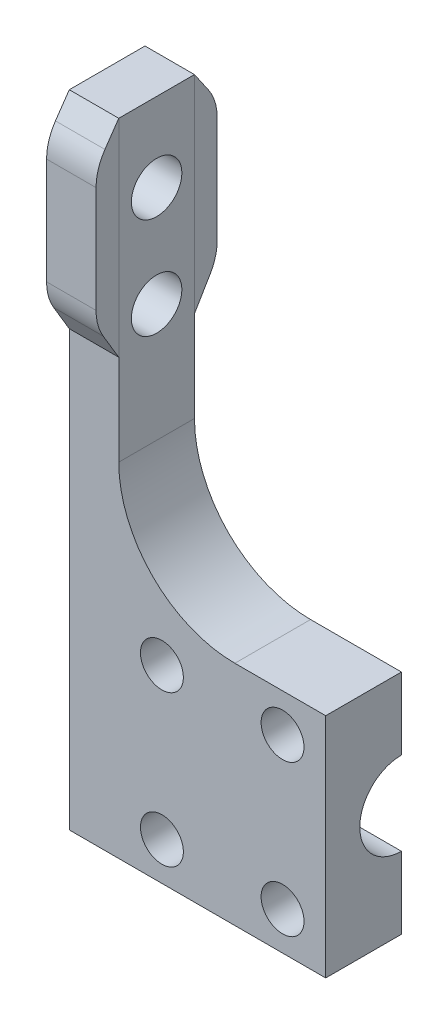
ISO-10303-21;
HEADER;
FILE_DESCRIPTION(('STEP AP214'),'2;1');
FILE_NAME('part.step','',(''),(''),'','','');
FILE_SCHEMA(('AUTOMOTIVE_DESIGN { 1 0 10303 214 1 1 1 1 }'));
ENDSEC;
DATA;
#1=APPLICATION_CONTEXT('core data for automotive mechanical design processes');
#2=APPLICATION_PROTOCOL_DEFINITION('international standard','automotive_design',2000,#1);
#3=PRODUCT_CONTEXT('',#1,'mechanical');
#4=PRODUCT('Part','Part','',(#3));
#5=PRODUCT_RELATED_PRODUCT_CATEGORY('part','',(#4));
#6=PRODUCT_DEFINITION_FORMATION('','',#4);
#7=PRODUCT_DEFINITION_CONTEXT('part definition',#1,'design');
#8=PRODUCT_DEFINITION('design','',#6,#7);
#9=PRODUCT_DEFINITION_SHAPE('','',#8);
#10=(LENGTH_UNIT() NAMED_UNIT(*) SI_UNIT(.MILLI.,.METRE.));
#11=(NAMED_UNIT(*) PLANE_ANGLE_UNIT() SI_UNIT($,.RADIAN.));
#12=(NAMED_UNIT(*) SI_UNIT($,.STERADIAN.) SOLID_ANGLE_UNIT());
#13=UNCERTAINTY_MEASURE_WITH_UNIT(LENGTH_MEASURE(1.E-05),#10,'distance_accuracy_value','');
#14=(GEOMETRIC_REPRESENTATION_CONTEXT(3) GLOBAL_UNCERTAINTY_ASSIGNED_CONTEXT((#13)) GLOBAL_UNIT_ASSIGNED_CONTEXT((#10,
#11,#12)) REPRESENTATION_CONTEXT('',''));
#15=CARTESIAN_POINT('',(0.,0.,0.));
#16=DIRECTION('',(0.,0.,1.));
#17=DIRECTION('',(1.,0.,0.));
#18=AXIS2_PLACEMENT_3D('',#15,#16,#17);
#19=CARTESIAN_POINT('',(-30.3,104.5,15.));
#20=DIRECTION('',(-1.,0.,0.));
#21=DIRECTION('',(0.,-1.,0.));
#22=AXIS2_PLACEMENT_3D('',#19,#20,#21);
#23=PLANE('',#22);
#24=DIRECTION('',(0.,1.,0.));
#25=VECTOR('',#24,1.);
#26=CARTESIAN_POINT('',(-30.3,63.5,15.));
#27=LINE('',#26,#25);
#28=CARTESIAN_POINT('',(-30.3,63.5,15.));
#29=VERTEX_POINT('',#28);
#30=CARTESIAN_POINT('',(-30.3,104.5,15.));
#31=VERTEX_POINT('',#30);
#32=EDGE_CURVE('E51',#29,#31,#27,.T.);
#33=ORIENTED_EDGE('',*,*,#32,.F.);
#34=DIRECTION('',(0.,-0.858384562837149,-0.513006766312957));
#35=VECTOR('',#34,1.);
#36=CARTESIAN_POINT('',(-30.3,63.5,15.));
#37=LINE('',#36,#35);
#38=CARTESIAN_POINT('',(-30.3,68.6600205989331,18.0838456283715));
#39=VERTEX_POINT('',#38);
#40=EDGE_CURVE('E125',#39,#29,#37,.T.);
#41=ORIENTED_EDGE('',*,*,#40,.F.);
#42=CARTESIAN_POINT('',(-30.3,73.7900882620627,9.50000000000002));
#43=DIRECTION('',(-1.,0.,0.));
#44=DIRECTION('',(0.,-1.,0.));
#45=AXIS2_PLACEMENT_3D('',#42,#43,#44);
#46=CIRCLE('',#45,10.);
#47=CARTESIAN_POINT('',(-30.3,73.7900882620627,19.5));
#48=VERTEX_POINT('',#47);
#49=EDGE_CURVE('E129',#48,#39,#46,.F.);
#50=ORIENTED_EDGE('',*,*,#49,.F.);
#51=DIRECTION('',(0.,-1.,0.));
#52=VECTOR('',#51,1.);
#53=CARTESIAN_POINT('',(-30.3,73.7900882620627,19.5));
#54=LINE('',#53,#52);
#55=CARTESIAN_POINT('',(-30.3,94.8518506562056,19.5));
#56=VERTEX_POINT('',#55);
#57=EDGE_CURVE('E80',#56,#48,#54,.T.);
#58=ORIENTED_EDGE('',*,*,#57,.F.);
#59=CARTESIAN_POINT('',(-30.3,94.8518506562057,9.50000000000002));
#60=DIRECTION('',(-1.,0.,0.));
#61=DIRECTION('',(0.,-1.,0.));
#62=AXIS2_PLACEMENT_3D('',#59,#60,#61);
#63=CIRCLE('',#62,10.);
#64=CARTESIAN_POINT('',(-30.3,100.520232847648,17.7382912871384));
#65=VERTEX_POINT('',#64);
#66=EDGE_CURVE('E85',#65,#56,#63,.F.);
#67=ORIENTED_EDGE('',*,*,#66,.F.);
#68=DIRECTION('',(0.,-0.823829128713842,0.566838219144221));
#69=VECTOR('',#68,1.);
#70=CARTESIAN_POINT('',(-30.3,100.520232847648,17.7382912871384));
#71=LINE('',#70,#69);
#72=EDGE_CURVE('E106',#31,#65,#71,.T.);
#73=ORIENTED_EDGE('',*,*,#72,.F.);
#74=EDGE_LOOP('',(#33,#41,#50,#58,#67,#73));
#75=FACE_BOUND('',#74,.T.);
#76=ADVANCED_FACE('F43',(#75),#23,.T.);
#77=CARTESIAN_POINT('',(-20.5,94.8518506562057,9.50000000000002));
#78=DIRECTION('',(-1.,0.,0.));
#79=DIRECTION('',(0.,0.,1.));
#80=AXIS2_PLACEMENT_3D('',#77,#78,#79);
#81=PLANE('',#80);
#82=DIRECTION('',(0.,1.,0.));
#83=VECTOR('',#82,1.);
#84=CARTESIAN_POINT('',(-20.5,63.5,15.));
#85=LINE('',#84,#83);
#86=CARTESIAN_POINT('',(-20.5,63.5,15.));
#87=VERTEX_POINT('',#86);
#88=CARTESIAN_POINT('',(-20.5,104.5,15.));
#89=VERTEX_POINT('',#88);
#90=EDGE_CURVE('E116',#87,#89,#85,.T.);
#91=ORIENTED_EDGE('',*,*,#90,.T.);
#92=DIRECTION('',(0.,-0.823829128713842,0.566838219144221));
#93=VECTOR('',#92,1.);
#94=CARTESIAN_POINT('',(-20.5,100.520232847648,17.7382912871384));
#95=LINE('',#94,#93);
#96=CARTESIAN_POINT('',(-20.5,100.520232847648,17.7382912871384));
#97=VERTEX_POINT('',#96);
#98=EDGE_CURVE('E104',#89,#97,#95,.T.);
#99=ORIENTED_EDGE('',*,*,#98,.T.);
#100=CARTESIAN_POINT('',(-20.5,94.8518506562057,9.50000000000002));
#101=DIRECTION('',(1.,0.,0.));
#102=DIRECTION('',(0.,0.,1.));
#103=AXIS2_PLACEMENT_3D('',#100,#101,#102);
#104=CIRCLE('',#103,10.);
#105=CARTESIAN_POINT('',(-20.5,94.8518506562056,19.5));
#106=VERTEX_POINT('',#105);
#107=EDGE_CURVE('E108',#97,#106,#104,.T.);
#108=ORIENTED_EDGE('',*,*,#107,.T.);
#109=DIRECTION('',(0.,-1.,0.));
#110=VECTOR('',#109,1.);
#111=CARTESIAN_POINT('',(-20.5,73.7900882620627,19.5));
#112=LINE('',#111,#110);
#113=CARTESIAN_POINT('',(-20.5,73.7900882620627,19.5));
#114=VERTEX_POINT('',#113);
#115=EDGE_CURVE('E112',#106,#114,#112,.T.);
#116=ORIENTED_EDGE('',*,*,#115,.T.);
#117=CARTESIAN_POINT('',(-20.5,73.7900882620627,9.50000000000002));
#118=DIRECTION('',(1.,0.,0.));
#119=DIRECTION('',(0.,0.,1.));
#120=AXIS2_PLACEMENT_3D('',#117,#118,#119);
#121=CIRCLE('',#120,10.);
#122=CARTESIAN_POINT('',(-20.5,68.6600205989331,18.0838456283715));
#123=VERTEX_POINT('',#122);
#124=EDGE_CURVE('E144',#114,#123,#121,.T.);
#125=ORIENTED_EDGE('',*,*,#124,.T.);
#126=DIRECTION('',(0.,-0.858384562837149,-0.513006766312957));
#127=VECTOR('',#126,1.);
#128=CARTESIAN_POINT('',(-20.5,63.5,15.));
#129=LINE('',#128,#127);
#130=EDGE_CURVE('E122',#123,#87,#129,.T.);
#131=ORIENTED_EDGE('',*,*,#130,.T.);
#132=EDGE_LOOP('',(#91,#99,#108,#116,#125,#131));
#133=FACE_BOUND('',#132,.T.);
#134=ADVANCED_FACE('F114',(#133),#81,.F.);
#135=CARTESIAN_POINT('',(-71.5462119472807,100.520232847648,17.7382912871384));
#136=DIRECTION('',(0.,0.566838219144221,0.823829128713842));
#137=DIRECTION('',(0.,-0.823829128713842,0.566838219144221));
#138=AXIS2_PLACEMENT_3D('',#135,#136,#137);
#139=PLANE('',#138);
#140=DIRECTION('',(1.,0.,0.));
#141=VECTOR('',#140,1.);
#142=CARTESIAN_POINT('',(-71.5462119472807,104.5,15.));
#143=LINE('',#142,#141);
#144=EDGE_CURVE('E12',#31,#89,#143,.T.);
#145=ORIENTED_EDGE('',*,*,#144,.F.);
#146=ORIENTED_EDGE('',*,*,#72,.T.);
#147=DIRECTION('',(1.,0.,0.));
#148=VECTOR('',#147,1.);
#149=CARTESIAN_POINT('',(-71.5462119472807,100.520232847648,17.7382912871384));
#150=LINE('',#149,#148);
#151=EDGE_CURVE('E101',#65,#97,#150,.T.);
#152=ORIENTED_EDGE('',*,*,#151,.T.);
#153=ORIENTED_EDGE('',*,*,#98,.F.);
#154=EDGE_LOOP('',(#145,#146,#152,#153));
#155=FACE_BOUND('',#154,.T.);
#156=ADVANCED_FACE('F102',(#155),#139,.T.);
#157=CARTESIAN_POINT('',(-71.5462119472807,94.8518506562057,9.50000000000002));
#158=DIRECTION('',(1.,0.,0.));
#159=DIRECTION('',(0.,1.,0.));
#160=AXIS2_PLACEMENT_3D('',#157,#158,#159);
#161=CYLINDRICAL_SURFACE('',#160,10.);
#162=ORIENTED_EDGE('',*,*,#151,.F.);
#163=ORIENTED_EDGE('',*,*,#66,.T.);
#164=DIRECTION('',(1.,0.,0.));
#165=VECTOR('',#164,1.);
#166=CARTESIAN_POINT('',(-71.5462119472807,94.8518506562056,19.5));
#167=LINE('',#166,#165);
#168=EDGE_CURVE('E96',#56,#106,#167,.T.);
#169=ORIENTED_EDGE('',*,*,#168,.T.);
#170=ORIENTED_EDGE('',*,*,#107,.F.);
#171=EDGE_LOOP('',(#162,#163,#169,#170));
#172=FACE_BOUND('',#171,.T.);
#173=ADVANCED_FACE('F109',(#172),#161,.T.);
#174=CARTESIAN_POINT('',(-71.5462119472807,73.7900882620627,19.5));
#175=DIRECTION('',(0.,0.,1.));
#176=DIRECTION('',(0.,-1.,0.));
#177=AXIS2_PLACEMENT_3D('',#174,#175,#176);
#178=PLANE('',#177);
#179=ORIENTED_EDGE('',*,*,#168,.F.);
#180=ORIENTED_EDGE('',*,*,#57,.T.);
#181=DIRECTION('',(1.,0.,0.));
#182=VECTOR('',#181,1.);
#183=CARTESIAN_POINT('',(-71.5462119472807,73.7900882620627,19.5));
#184=LINE('',#183,#182);
#185=EDGE_CURVE('E132',#48,#114,#184,.T.);
#186=ORIENTED_EDGE('',*,*,#185,.T.);
#187=ORIENTED_EDGE('',*,*,#115,.F.);
#188=EDGE_LOOP('',(#179,#180,#186,#187));
#189=FACE_BOUND('',#188,.T.);
#190=ADVANCED_FACE('F141',(#189),#178,.T.);
#191=CARTESIAN_POINT('',(-71.5462119472807,73.7900882620627,9.50000000000002));
#192=DIRECTION('',(1.,0.,0.));
#193=DIRECTION('',(0.,1.,0.));
#194=AXIS2_PLACEMENT_3D('',#191,#192,#193);
#195=CYLINDRICAL_SURFACE('',#194,10.);
#196=ORIENTED_EDGE('',*,*,#185,.F.);
#197=ORIENTED_EDGE('',*,*,#49,.T.);
#198=DIRECTION('',(1.,0.,0.));
#199=VECTOR('',#198,1.);
#200=CARTESIAN_POINT('',(-71.5462119472807,68.6600205989331,18.0838456283715));
#201=LINE('',#200,#199);
#202=EDGE_CURVE('E128',#39,#123,#201,.T.);
#203=ORIENTED_EDGE('',*,*,#202,.T.);
#204=ORIENTED_EDGE('',*,*,#124,.F.);
#205=EDGE_LOOP('',(#196,#197,#203,#204));
#206=FACE_BOUND('',#205,.T.);
#207=ADVANCED_FACE('F145',(#206),#195,.T.);
#208=CARTESIAN_POINT('',(-71.5462119472807,63.5,15.));
#209=DIRECTION('',(0.,-0.513006766312957,0.858384562837149));
#210=DIRECTION('',(0.,-0.858384562837149,-0.513006766312957));
#211=AXIS2_PLACEMENT_3D('',#208,#209,#210);
#212=PLANE('',#211);
#213=ORIENTED_EDGE('',*,*,#202,.F.);
#214=ORIENTED_EDGE('',*,*,#40,.T.);
#215=DIRECTION('',(1.,0.,0.));
#216=VECTOR('',#215,1.);
#217=CARTESIAN_POINT('',(-71.5462119472807,63.5,15.));
#218=LINE('',#217,#216);
#219=EDGE_CURVE('E124',#29,#87,#218,.T.);
#220=ORIENTED_EDGE('',*,*,#219,.T.);
#221=ORIENTED_EDGE('',*,*,#130,.F.);
#222=EDGE_LOOP('',(#213,#214,#220,#221));
#223=FACE_BOUND('',#222,.T.);
#224=ADVANCED_FACE('F151',(#223),#212,.T.);
#225=CARTESIAN_POINT('',(-71.5462119472807,63.5,15.));
#226=DIRECTION('',(0.,0.,-1.));
#227=DIRECTION('',(0.,1.,0.));
#228=AXIS2_PLACEMENT_3D('',#225,#226,#227);
#229=PLANE('',#228);
#230=ORIENTED_EDGE('',*,*,#219,.F.);
#231=ORIENTED_EDGE('',*,*,#32,.T.);
#232=ORIENTED_EDGE('',*,*,#144,.T.);
#233=ORIENTED_EDGE('',*,*,#90,.F.);
#234=EDGE_LOOP('',(#230,#231,#232,#233));
#235=FACE_BOUND('',#234,.T.);
#236=ADVANCED_FACE('F153',(#235),#229,.T.);
#237=CLOSED_SHELL('',(#76,#134,#156,#173,#190,#207,#224,#236));
#238=MANIFOLD_SOLID_BREP('B2',#237);
#239=CARTESIAN_POINT('',(-30.3,104.5,15.));
#240=DIRECTION('',(-1.,0.,0.));
#241=DIRECTION('',(0.,-1.,0.));
#242=AXIS2_PLACEMENT_3D('',#239,#240,#241);
#243=PLANE('',#242);
#244=DIRECTION('',(0.,-1.,0.));
#245=VECTOR('',#244,1.);
#246=CARTESIAN_POINT('',(-30.3,63.5,0.));
#247=LINE('',#246,#245);
#248=CARTESIAN_POINT('',(-30.3,104.5,0.));
#249=VERTEX_POINT('',#248);
#250=CARTESIAN_POINT('',(-30.3,63.5,0.));
#251=VERTEX_POINT('',#250);
#252=EDGE_CURVE('E235',#249,#251,#247,.T.);
#253=ORIENTED_EDGE('',*,*,#252,.F.);
#254=DIRECTION('',(0.,0.823829128713843,0.566838219144221));
#255=VECTOR('',#254,1.);
#256=CARTESIAN_POINT('',(-30.3,100.520232847648,-2.7382912871384));
#257=LINE('',#256,#255);
#258=CARTESIAN_POINT('',(-30.3,100.520232847648,-2.7382912871384));
#259=VERTEX_POINT('',#258);
#260=EDGE_CURVE('E309',#259,#249,#257,.T.);
#261=ORIENTED_EDGE('',*,*,#260,.F.);
#262=CARTESIAN_POINT('',(-30.3,94.8518506562057,5.5));
#263=DIRECTION('',(-1.,0.,0.));
#264=DIRECTION('',(0.,-1.,0.));
#265=AXIS2_PLACEMENT_3D('',#262,#263,#264);
#266=CIRCLE('',#265,10.);
#267=CARTESIAN_POINT('',(-30.3,94.8518506562056,-4.5));
#268=VERTEX_POINT('',#267);
#269=EDGE_CURVE('E313',#268,#259,#266,.F.);
#270=ORIENTED_EDGE('',*,*,#269,.F.);
#271=DIRECTION('',(0.,1.,0.));
#272=VECTOR('',#271,1.);
#273=CARTESIAN_POINT('',(-30.3,73.7900882620627,-4.5));
#274=LINE('',#273,#272);
#275=CARTESIAN_POINT('',(-30.3,73.7900882620627,-4.5));
#276=VERTEX_POINT('',#275);
#277=EDGE_CURVE('E264',#276,#268,#274,.T.);
#278=ORIENTED_EDGE('',*,*,#277,.F.);
#279=CARTESIAN_POINT('',(-30.3,73.7900882620627,5.5));
#280=DIRECTION('',(-1.,0.,0.));
#281=DIRECTION('',(0.,-1.,0.));
#282=AXIS2_PLACEMENT_3D('',#279,#280,#281);
#283=CIRCLE('',#282,10.);
#284=CARTESIAN_POINT('',(-30.3,68.6600205989331,-3.08384562837148));
#285=VERTEX_POINT('',#284);
#286=EDGE_CURVE('E269',#285,#276,#283,.F.);
#287=ORIENTED_EDGE('',*,*,#286,.F.);
#288=DIRECTION('',(0.,0.858384562837149,-0.513006766312956));
#289=VECTOR('',#288,1.);
#290=CARTESIAN_POINT('',(-30.3,63.5,0.));
#291=LINE('',#290,#289);
#292=EDGE_CURVE('E290',#251,#285,#291,.T.);
#293=ORIENTED_EDGE('',*,*,#292,.F.);
#294=EDGE_LOOP('',(#253,#261,#270,#278,#287,#293));
#295=FACE_BOUND('',#294,.T.);
#296=ADVANCED_FACE('F227',(#295),#243,.T.);
#297=CARTESIAN_POINT('',(-20.5,94.8518506562057,5.5));
#298=DIRECTION('',(1.,0.,0.));
#299=DIRECTION('',(0.,0.,-1.));
#300=AXIS2_PLACEMENT_3D('',#297,#298,#299);
#301=PLANE('',#300);
#302=DIRECTION('',(0.,-1.,0.));
#303=VECTOR('',#302,1.);
#304=CARTESIAN_POINT('',(-20.5,63.5,0.));
#305=LINE('',#304,#303);
#306=CARTESIAN_POINT('',(-20.5,104.5,0.));
#307=VERTEX_POINT('',#306);
#308=CARTESIAN_POINT('',(-20.5,63.5,0.));
#309=VERTEX_POINT('',#308);
#310=EDGE_CURVE('E300',#307,#309,#305,.T.);
#311=ORIENTED_EDGE('',*,*,#310,.T.);
#312=DIRECTION('',(0.,0.858384562837149,-0.513006766312956));
#313=VECTOR('',#312,1.);
#314=CARTESIAN_POINT('',(-20.5,63.5,0.));
#315=LINE('',#314,#313);
#316=CARTESIAN_POINT('',(-20.5,68.6600205989331,-3.08384562837148));
#317=VERTEX_POINT('',#316);
#318=EDGE_CURVE('E288',#309,#317,#315,.T.);
#319=ORIENTED_EDGE('',*,*,#318,.T.);
#320=CARTESIAN_POINT('',(-20.5,73.7900882620627,5.5));
#321=DIRECTION('',(1.,0.,0.));
#322=DIRECTION('',(0.,0.,-1.));
#323=AXIS2_PLACEMENT_3D('',#320,#321,#322);
#324=CIRCLE('',#323,10.);
#325=CARTESIAN_POINT('',(-20.5,73.7900882620627,-4.5));
#326=VERTEX_POINT('',#325);
#327=EDGE_CURVE('E292',#317,#326,#324,.T.);
#328=ORIENTED_EDGE('',*,*,#327,.T.);
#329=DIRECTION('',(0.,1.,0.));
#330=VECTOR('',#329,1.);
#331=CARTESIAN_POINT('',(-20.5,73.7900882620627,-4.5));
#332=LINE('',#331,#330);
#333=CARTESIAN_POINT('',(-20.5,94.8518506562056,-4.5));
#334=VERTEX_POINT('',#333);
#335=EDGE_CURVE('E296',#326,#334,#332,.T.);
#336=ORIENTED_EDGE('',*,*,#335,.T.);
#337=CARTESIAN_POINT('',(-20.5,94.8518506562057,5.5));
#338=DIRECTION('',(1.,0.,0.));
#339=DIRECTION('',(0.,0.,-1.));
#340=AXIS2_PLACEMENT_3D('',#337,#338,#339);
#341=CIRCLE('',#340,10.);
#342=CARTESIAN_POINT('',(-20.5,100.520232847648,-2.7382912871384));
#343=VERTEX_POINT('',#342);
#344=EDGE_CURVE('E328',#334,#343,#341,.T.);
#345=ORIENTED_EDGE('',*,*,#344,.T.);
#346=DIRECTION('',(0.,0.823829128713842,0.566838219144221));
#347=VECTOR('',#346,1.);
#348=CARTESIAN_POINT('',(-20.5,100.520232847648,-2.7382912871384));
#349=LINE('',#348,#347);
#350=EDGE_CURVE('E306',#343,#307,#349,.T.);
#351=ORIENTED_EDGE('',*,*,#350,.T.);
#352=EDGE_LOOP('',(#311,#319,#328,#336,#345,#351));
#353=FACE_BOUND('',#352,.T.);
#354=ADVANCED_FACE('F298',(#353),#301,.T.);
#355=CARTESIAN_POINT('',(-71.5462119472807,63.5,0.));
#356=DIRECTION('',(0.,-0.513006766312956,-0.858384562837149));
#357=DIRECTION('',(0.,0.858384562837149,-0.513006766312956));
#358=AXIS2_PLACEMENT_3D('',#355,#356,#357);
#359=PLANE('',#358);
#360=DIRECTION('',(1.,0.,0.));
#361=VECTOR('',#360,1.);
#362=CARTESIAN_POINT('',(-71.5462119472807,63.5,0.));
#363=LINE('',#362,#361);
#364=EDGE_CURVE('E41',#251,#309,#363,.T.);
#365=ORIENTED_EDGE('',*,*,#364,.F.);
#366=ORIENTED_EDGE('',*,*,#292,.T.);
#367=DIRECTION('',(1.,0.,0.));
#368=VECTOR('',#367,1.);
#369=CARTESIAN_POINT('',(-71.5462119472807,68.6600205989331,-3.08384562837148));
#370=LINE('',#369,#368);
#371=EDGE_CURVE('E285',#285,#317,#370,.T.);
#372=ORIENTED_EDGE('',*,*,#371,.T.);
#373=ORIENTED_EDGE('',*,*,#318,.F.);
#374=EDGE_LOOP('',(#365,#366,#372,#373));
#375=FACE_BOUND('',#374,.T.);
#376=ADVANCED_FACE('F286',(#375),#359,.T.);
#377=CARTESIAN_POINT('',(-71.5462119472807,73.7900882620627,5.5));
#378=DIRECTION('',(1.,0.,0.));
#379=DIRECTION('',(0.,1.,0.));
#380=AXIS2_PLACEMENT_3D('',#377,#378,#379);
#381=CYLINDRICAL_SURFACE('',#380,10.);
#382=ORIENTED_EDGE('',*,*,#371,.F.);
#383=ORIENTED_EDGE('',*,*,#286,.T.);
#384=DIRECTION('',(1.,0.,0.));
#385=VECTOR('',#384,1.);
#386=CARTESIAN_POINT('',(-71.5462119472807,73.7900882620627,-4.5));
#387=LINE('',#386,#385);
#388=EDGE_CURVE('E280',#276,#326,#387,.T.);
#389=ORIENTED_EDGE('',*,*,#388,.T.);
#390=ORIENTED_EDGE('',*,*,#327,.F.);
#391=EDGE_LOOP('',(#382,#383,#389,#390));
#392=FACE_BOUND('',#391,.T.);
#393=ADVANCED_FACE('F293',(#392),#381,.T.);
#394=CARTESIAN_POINT('',(-71.5462119472807,73.7900882620627,-4.5));
#395=DIRECTION('',(0.,0.,-1.));
#396=DIRECTION('',(-1.,0.,0.));
#397=AXIS2_PLACEMENT_3D('',#394,#395,#396);
#398=PLANE('',#397);
#399=ORIENTED_EDGE('',*,*,#388,.F.);
#400=ORIENTED_EDGE('',*,*,#277,.T.);
#401=DIRECTION('',(1.,0.,0.));
#402=VECTOR('',#401,1.);
#403=CARTESIAN_POINT('',(-71.5462119472807,94.8518506562056,-4.5));
#404=LINE('',#403,#402);
#405=EDGE_CURVE('E316',#268,#334,#404,.T.);
#406=ORIENTED_EDGE('',*,*,#405,.T.);
#407=ORIENTED_EDGE('',*,*,#335,.F.);
#408=EDGE_LOOP('',(#399,#400,#406,#407));
#409=FACE_BOUND('',#408,.T.);
#410=ADVANCED_FACE('F325',(#409),#398,.T.);
#411=CARTESIAN_POINT('',(-71.5462119472807,94.8518506562057,5.5));
#412=DIRECTION('',(1.,0.,0.));
#413=DIRECTION('',(0.,1.,0.));
#414=AXIS2_PLACEMENT_3D('',#411,#412,#413);
#415=CYLINDRICAL_SURFACE('',#414,10.);
#416=ORIENTED_EDGE('',*,*,#405,.F.);
#417=ORIENTED_EDGE('',*,*,#269,.T.);
#418=DIRECTION('',(1.,0.,0.));
#419=VECTOR('',#418,1.);
#420=CARTESIAN_POINT('',(-71.5462119472807,100.520232847648,-2.7382912871384));
#421=LINE('',#420,#419);
#422=EDGE_CURVE('E312',#259,#343,#421,.T.);
#423=ORIENTED_EDGE('',*,*,#422,.T.);
#424=ORIENTED_EDGE('',*,*,#344,.F.);
#425=EDGE_LOOP('',(#416,#417,#423,#424));
#426=FACE_BOUND('',#425,.T.);
#427=ADVANCED_FACE('F329',(#426),#415,.T.);
#428=CARTESIAN_POINT('',(-71.5462119472807,100.520232847648,-2.7382912871384));
#429=DIRECTION('',(0.,0.566838219144221,-0.823829128713842));
#430=DIRECTION('',(0.,0.823829128713843,0.566838219144221));
#431=AXIS2_PLACEMENT_3D('',#428,#429,#430);
#432=PLANE('',#431);
#433=ORIENTED_EDGE('',*,*,#422,.F.);
#434=ORIENTED_EDGE('',*,*,#260,.T.);
#435=DIRECTION('',(1.,0.,0.));
#436=VECTOR('',#435,1.);
#437=CARTESIAN_POINT('',(-71.5462119472807,104.5,0.));
#438=LINE('',#437,#436);
#439=EDGE_CURVE('E308',#249,#307,#438,.T.);
#440=ORIENTED_EDGE('',*,*,#439,.T.);
#441=ORIENTED_EDGE('',*,*,#350,.F.);
#442=EDGE_LOOP('',(#433,#434,#440,#441));
#443=FACE_BOUND('',#442,.T.);
#444=ADVANCED_FACE('F335',(#443),#432,.T.);
#445=CARTESIAN_POINT('',(-71.5462119472807,63.5,0.));
#446=DIRECTION('',(0.,0.,1.));
#447=DIRECTION('',(1.,0.,0.));
#448=AXIS2_PLACEMENT_3D('',#445,#446,#447);
#449=PLANE('',#448);
#450=ORIENTED_EDGE('',*,*,#439,.F.);
#451=ORIENTED_EDGE('',*,*,#252,.T.);
#452=ORIENTED_EDGE('',*,*,#364,.T.);
#453=ORIENTED_EDGE('',*,*,#310,.F.);
#454=EDGE_LOOP('',(#450,#451,#452,#453));
#455=FACE_BOUND('',#454,.T.);
#456=ADVANCED_FACE('F337',(#455),#449,.T.);
#457=CLOSED_SHELL('',(#296,#354,#376,#393,#410,#427,#444,#456));
#458=MANIFOLD_SOLID_BREP('B6',#457);
#459=CARTESIAN_POINT('',(0.,0.,0.));
#460=DIRECTION('',(0.,0.,1.));
#461=DIRECTION('',(1.,0.,0.));
#462=AXIS2_PLACEMENT_3D('',#459,#460,#461);
#463=PLANE('',#462);
#464=CARTESIAN_POINT('',(-11.95,-14.95,0.));
#465=DIRECTION('',(0.,0.,1.));
#466=DIRECTION('',(1.,0.,0.));
#467=AXIS2_PLACEMENT_3D('',#464,#465,#466);
#468=CIRCLE('',#467,4.25);
#469=CARTESIAN_POINT('',(-7.7,-14.95,0.));
#470=VERTEX_POINT('',#469);
#471=EDGE_CURVE('E501',#470,#470,#468,.T.);
#472=ORIENTED_EDGE('',*,*,#471,.T.);
#473=EDGE_LOOP('',(#472));
#474=FACE_BOUND('',#473,.T.);
#475=CARTESIAN_POINT('',(11.95,-14.95,0.));
#476=DIRECTION('',(0.,0.,1.));
#477=DIRECTION('',(1.,0.,0.));
#478=AXIS2_PLACEMENT_3D('',#475,#476,#477);
#479=CIRCLE('',#478,4.25);
#480=CARTESIAN_POINT('',(16.2,-14.95,0.));
#481=VERTEX_POINT('',#480);
#482=EDGE_CURVE('E508',#481,#481,#479,.T.);
#483=ORIENTED_EDGE('',*,*,#482,.T.);
#484=EDGE_LOOP('',(#483));
#485=FACE_BOUND('',#484,.T.);
#486=DIRECTION('',(0.,1.,0.));
#487=VECTOR('',#486,1.);
#488=CARTESIAN_POINT('',(-30.3,104.5,0.));
#489=LINE('',#488,#487);
#490=CARTESIAN_POINT('',(-30.3,-22.5,0.));
#491=VERTEX_POINT('',#490);
#492=CARTESIAN_POINT('',(-30.3,-8.25,0.));
#493=VERTEX_POINT('',#492);
#494=EDGE_CURVE('E480',#491,#493,#489,.T.);
#495=ORIENTED_EDGE('',*,*,#494,.T.);
#496=DIRECTION('',(1.,0.,0.));
#497=VECTOR('',#496,1.);
#498=CARTESIAN_POINT('',(-44.5,-8.25,0.));
#499=LINE('',#498,#497);
#500=CARTESIAN_POINT('',(20.5,-8.25,0.));
#501=VERTEX_POINT('',#500);
#502=EDGE_CURVE('E416',#493,#501,#499,.T.);
#503=ORIENTED_EDGE('',*,*,#502,.T.);
#504=DIRECTION('',(0.,1.,0.));
#505=VECTOR('',#504,1.);
#506=CARTESIAN_POINT('',(20.5,22.5,0.));
#507=LINE('',#506,#505);
#508=CARTESIAN_POINT('',(20.5,-22.5,0.));
#509=VERTEX_POINT('',#508);
#510=EDGE_CURVE('E458',#509,#501,#507,.T.);
#511=ORIENTED_EDGE('',*,*,#510,.F.);
#512=DIRECTION('',(1.,0.,0.));
#513=VECTOR('',#512,1.);
#514=CARTESIAN_POINT('',(-20.5,-22.5,0.));
#515=LINE('',#514,#513);
#516=EDGE_CURVE('E439',#491,#509,#515,.T.);
#517=ORIENTED_EDGE('',*,*,#516,.F.);
#518=EDGE_LOOP('',(#495,#503,#511,#517));
#519=FACE_BOUND('',#518,.T.);
#520=ADVANCED_FACE('F402',(#474,#485,#519),#463,.F.);
#521=CARTESIAN_POINT('',(0.,0.,15.));
#522=DIRECTION('',(0.,0.,1.));
#523=DIRECTION('',(1.,0.,0.));
#524=AXIS2_PLACEMENT_3D('',#521,#522,#523);
#525=PLANE('',#524);
#526=CARTESIAN_POINT('',(11.95,-14.95,15.));
#527=DIRECTION('',(0.,0.,1.));
#528=DIRECTION('',(1.,0.,0.));
#529=AXIS2_PLACEMENT_3D('',#526,#527,#528);
#530=CIRCLE('',#529,4.25);
#531=CARTESIAN_POINT('',(16.2,-14.95,15.));
#532=VERTEX_POINT('',#531);
#533=EDGE_CURVE('E511',#532,#532,#530,.T.);
#534=ORIENTED_EDGE('',*,*,#533,.F.);
#535=EDGE_LOOP('',(#534));
#536=FACE_BOUND('',#535,.T.);
#537=CARTESIAN_POINT('',(-11.95,14.95,15.));
#538=DIRECTION('',(0.,0.,1.));
#539=DIRECTION('',(1.,0.,0.));
#540=AXIS2_PLACEMENT_3D('',#537,#538,#539);
#541=CIRCLE('',#540,4.25);
#542=CARTESIAN_POINT('',(-7.7,14.95,15.));
#543=VERTEX_POINT('',#542);
#544=EDGE_CURVE('E465',#543,#543,#541,.T.);
#545=ORIENTED_EDGE('',*,*,#544,.F.);
#546=EDGE_LOOP('',(#545));
#547=FACE_BOUND('',#546,.T.);
#548=DIRECTION('',(0.,1.,0.));
#549=VECTOR('',#548,1.);
#550=CARTESIAN_POINT('',(20.5,22.5,15.));
#551=LINE('',#550,#549);
#552=CARTESIAN_POINT('',(20.5,-22.5,15.));
#553=VERTEX_POINT('',#552);
#554=CARTESIAN_POINT('',(20.5,22.5,15.));
#555=VERTEX_POINT('',#554);
#556=EDGE_CURVE('E451',#553,#555,#551,.T.);
#557=ORIENTED_EDGE('',*,*,#556,.T.);
#558=DIRECTION('',(-1.,0.,0.));
#559=VECTOR('',#558,1.);
#560=CARTESIAN_POINT('',(-20.5,22.5,15.));
#561=LINE('',#560,#559);
#562=CARTESIAN_POINT('',(2.50000000000017,22.5,15.));
#563=VERTEX_POINT('',#562);
#564=EDGE_CURVE('E527',#555,#563,#561,.T.);
#565=ORIENTED_EDGE('',*,*,#564,.T.);
#566=CARTESIAN_POINT('',(2.50000000000001,45.5,15.));
#567=DIRECTION('',(0.,0.,1.));
#568=DIRECTION('',(-1.,0.,0.));
#569=AXIS2_PLACEMENT_3D('',#566,#567,#568);
#570=CIRCLE('',#569,23.);
#571=CARTESIAN_POINT('',(-20.5,45.5000000000002,15.));
#572=VERTEX_POINT('',#571);
#573=EDGE_CURVE('E536',#572,#563,#570,.T.);
#574=ORIENTED_EDGE('',*,*,#573,.F.);
#575=DIRECTION('',(0.,-1.,0.));
#576=VECTOR('',#575,1.);
#577=CARTESIAN_POINT('',(-20.5,-22.5,15.));
#578=LINE('',#577,#576);
#579=CARTESIAN_POINT('',(-20.5,104.5,15.));
#580=VERTEX_POINT('',#579);
#581=EDGE_CURVE('E491',#580,#572,#578,.T.);
#582=ORIENTED_EDGE('',*,*,#581,.F.);
#583=DIRECTION('',(1.,0.,0.));
#584=VECTOR('',#583,1.);
#585=CARTESIAN_POINT('',(-20.5,104.5,15.));
#586=LINE('',#585,#584);
#587=CARTESIAN_POINT('',(-30.3,104.5,15.));
#588=VERTEX_POINT('',#587);
#589=EDGE_CURVE('E569',#588,#580,#586,.T.);
#590=ORIENTED_EDGE('',*,*,#589,.F.);
#591=DIRECTION('',(0.,1.,0.));
#592=VECTOR('',#591,1.);
#593=CARTESIAN_POINT('',(-30.3,104.5,15.));
#594=LINE('',#593,#592);
#595=CARTESIAN_POINT('',(-30.3,-22.5,15.));
#596=VERTEX_POINT('',#595);
#597=EDGE_CURVE('E497',#596,#588,#594,.T.);
#598=ORIENTED_EDGE('',*,*,#597,.F.);
#599=DIRECTION('',(1.,0.,0.));
#600=VECTOR('',#599,1.);
#601=CARTESIAN_POINT('',(-20.5,-22.5,15.));
#602=LINE('',#601,#600);
#603=EDGE_CURVE('E425',#596,#553,#602,.T.);
#604=ORIENTED_EDGE('',*,*,#603,.T.);
#605=EDGE_LOOP('',(#557,#565,#574,#582,#590,#598,#604));
#606=FACE_BOUND('',#605,.T.);
#607=CARTESIAN_POINT('',(11.95,14.95,15.));
#608=DIRECTION('',(0.,0.,1.));
#609=DIRECTION('',(1.,0.,0.));
#610=AXIS2_PLACEMENT_3D('',#607,#608,#609);
#611=CIRCLE('',#610,4.25);
#612=CARTESIAN_POINT('',(16.2,14.95,15.));
#613=VERTEX_POINT('',#612);
#614=EDGE_CURVE('E517',#613,#613,#611,.T.);
#615=ORIENTED_EDGE('',*,*,#614,.F.);
#616=EDGE_LOOP('',(#615));
#617=FACE_BOUND('',#616,.T.);
#618=CARTESIAN_POINT('',(-11.95,-14.95,15.));
#619=DIRECTION('',(0.,0.,1.));
#620=DIRECTION('',(1.,0.,0.));
#621=AXIS2_PLACEMENT_3D('',#618,#619,#620);
#622=CIRCLE('',#621,4.25);
#623=CARTESIAN_POINT('',(-7.7,-14.95,15.));
#624=VERTEX_POINT('',#623);
#625=EDGE_CURVE('E505',#624,#624,#622,.T.);
#626=ORIENTED_EDGE('',*,*,#625,.F.);
#627=EDGE_LOOP('',(#626));
#628=FACE_BOUND('',#627,.T.);
#629=ADVANCED_FACE('F531',(#536,#547,#606,#617,#628),#525,.T.);
#630=CARTESIAN_POINT('',(20.5,8.25,0.));
#631=VERTEX_POINT('',#630);
#632=CARTESIAN_POINT('',(20.5,22.5,0.));
#633=VERTEX_POINT('',#632);
#634=EDGE_CURVE('E461',#631,#633,#507,.T.);
#635=ORIENTED_EDGE('',*,*,#634,.F.);
#636=DIRECTION('',(1.,0.,0.));
#637=VECTOR('',#636,1.);
#638=CARTESIAN_POINT('',(-44.5,8.25,0.));
#639=LINE('',#638,#637);
#640=CARTESIAN_POINT('',(-30.3,8.25,0.));
#641=VERTEX_POINT('',#640);
#642=EDGE_CURVE('E560',#631,#641,#639,.F.);
#643=ORIENTED_EDGE('',*,*,#642,.T.);
#644=CARTESIAN_POINT('',(-30.3,104.5,0.));
#645=VERTEX_POINT('',#644);
#646=EDGE_CURVE('E476',#641,#645,#489,.T.);
#647=ORIENTED_EDGE('',*,*,#646,.T.);
#648=DIRECTION('',(1.,0.,0.));
#649=VECTOR('',#648,1.);
#650=CARTESIAN_POINT('',(-20.5,104.5,0.));
#651=LINE('',#650,#649);
#652=CARTESIAN_POINT('',(-20.5,104.5,0.));
#653=VERTEX_POINT('',#652);
#654=EDGE_CURVE('E488',#645,#653,#651,.T.);
#655=ORIENTED_EDGE('',*,*,#654,.T.);
#656=DIRECTION('',(0.,-1.,0.));
#657=VECTOR('',#656,1.);
#658=CARTESIAN_POINT('',(-20.5,-22.5,0.));
#659=LINE('',#658,#657);
#660=CARTESIAN_POINT('',(-20.5,45.5000000000002,0.));
#661=VERTEX_POINT('',#660);
#662=EDGE_CURVE('E494',#653,#661,#659,.T.);
#663=ORIENTED_EDGE('',*,*,#662,.T.);
#664=CARTESIAN_POINT('',(2.50000000000001,45.5,0.));
#665=DIRECTION('',(0.,0.,1.));
#666=DIRECTION('',(-1.,0.,0.));
#667=AXIS2_PLACEMENT_3D('',#664,#665,#666);
#668=CIRCLE('',#667,23.);
#669=CARTESIAN_POINT('',(2.50000000000017,22.5,0.));
#670=VERTEX_POINT('',#669);
#671=EDGE_CURVE('E555',#661,#670,#668,.T.);
#672=ORIENTED_EDGE('',*,*,#671,.T.);
#673=DIRECTION('',(-1.,0.,0.));
#674=VECTOR('',#673,1.);
#675=CARTESIAN_POINT('',(-20.5,22.5,0.));
#676=LINE('',#675,#674);
#677=EDGE_CURVE('E452',#633,#670,#676,.T.);
#678=ORIENTED_EDGE('',*,*,#677,.F.);
#679=EDGE_LOOP('',(#635,#643,#647,#655,#663,#672,#678));
#680=FACE_BOUND('',#679,.T.);
#681=CARTESIAN_POINT('',(-11.95,14.95,0.));
#682=DIRECTION('',(0.,0.,1.));
#683=DIRECTION('',(1.,0.,0.));
#684=AXIS2_PLACEMENT_3D('',#681,#682,#683);
#685=CIRCLE('',#684,4.25);
#686=CARTESIAN_POINT('',(-7.7,14.95,0.));
#687=VERTEX_POINT('',#686);
#688=EDGE_CURVE('E520',#687,#687,#685,.T.);
#689=ORIENTED_EDGE('',*,*,#688,.T.);
#690=EDGE_LOOP('',(#689));
#691=FACE_BOUND('',#690,.T.);
#692=CARTESIAN_POINT('',(11.95,14.95,0.));
#693=DIRECTION('',(0.,0.,1.));
#694=DIRECTION('',(1.,0.,0.));
#695=AXIS2_PLACEMENT_3D('',#692,#693,#694);
#696=CIRCLE('',#695,4.25);
#697=CARTESIAN_POINT('',(16.2,14.95,0.));
#698=VERTEX_POINT('',#697);
#699=EDGE_CURVE('E514',#698,#698,#696,.T.);
#700=ORIENTED_EDGE('',*,*,#699,.T.);
#701=EDGE_LOOP('',(#700));
#702=FACE_BOUND('',#701,.T.);
#703=ADVANCED_FACE('F600',(#680,#691,#702),#463,.F.);
#704=CARTESIAN_POINT('',(20.5,22.5,15.));
#705=DIRECTION('',(-1.,0.,0.));
#706=DIRECTION('',(0.,-1.,0.));
#707=AXIS2_PLACEMENT_3D('',#704,#705,#706);
#708=PLANE('',#707);
#709=ORIENTED_EDGE('',*,*,#510,.T.);
#710=CARTESIAN_POINT('',(20.5,0.,0.));
#711=DIRECTION('',(1.,0.,0.));
#712=DIRECTION('',(0.,1.,0.));
#713=AXIS2_PLACEMENT_3D('',#710,#711,#712);
#714=CIRCLE('',#713,8.25);
#715=EDGE_CURVE('E553',#631,#501,#714,.T.);
#716=ORIENTED_EDGE('',*,*,#715,.F.);
#717=ORIENTED_EDGE('',*,*,#634,.T.);
#718=DIRECTION('',(0.,0.,-1.));
#719=VECTOR('',#718,1.);
#720=CARTESIAN_POINT('',(20.5,22.5,15.));
#721=LINE('',#720,#719);
#722=EDGE_CURVE('E410',#555,#633,#721,.T.);
#723=ORIENTED_EDGE('',*,*,#722,.F.);
#724=ORIENTED_EDGE('',*,*,#556,.F.);
#725=DIRECTION('',(0.,0.,-1.));
#726=VECTOR('',#725,1.);
#727=CARTESIAN_POINT('',(20.5,-22.5,15.));
#728=LINE('',#727,#726);
#729=EDGE_CURVE('E442',#553,#509,#728,.T.);
#730=ORIENTED_EDGE('',*,*,#729,.T.);
#731=EDGE_LOOP('',(#709,#716,#717,#723,#724,#730));
#732=FACE_BOUND('',#731,.T.);
#733=ADVANCED_FACE('F404',(#732),#708,.F.);
#734=CARTESIAN_POINT('',(-20.5,22.5,15.));
#735=DIRECTION('',(0.,-1.,0.));
#736=DIRECTION('',(0.,0.,-1.));
#737=AXIS2_PLACEMENT_3D('',#734,#735,#736);
#738=PLANE('',#737);
#739=ORIENTED_EDGE('',*,*,#677,.T.);
#740=DIRECTION('',(0.,0.,-1.));
#741=VECTOR('',#740,1.);
#742=CARTESIAN_POINT('',(2.50000000000017,22.5,15.));
#743=LINE('',#742,#741);
#744=EDGE_CURVE('E544',#563,#670,#743,.T.);
#745=ORIENTED_EDGE('',*,*,#744,.F.);
#746=ORIENTED_EDGE('',*,*,#564,.F.);
#747=ORIENTED_EDGE('',*,*,#722,.T.);
#748=EDGE_LOOP('',(#739,#745,#746,#747));
#749=FACE_BOUND('',#748,.T.);
#750=ADVANCED_FACE('F542',(#749),#738,.F.);
#751=CARTESIAN_POINT('',(-20.5,-22.5,15.));
#752=DIRECTION('',(0.,1.,0.));
#753=DIRECTION('',(0.,0.,1.));
#754=AXIS2_PLACEMENT_3D('',#751,#752,#753);
#755=PLANE('',#754);
#756=ORIENTED_EDGE('',*,*,#516,.T.);
#757=ORIENTED_EDGE('',*,*,#729,.F.);
#758=ORIENTED_EDGE('',*,*,#603,.F.);
#759=DIRECTION('',(0.,0.,-1.));
#760=VECTOR('',#759,1.);
#761=CARTESIAN_POINT('',(-30.3,-22.5,15.));
#762=LINE('',#761,#760);
#763=EDGE_CURVE('E446',#596,#491,#762,.T.);
#764=ORIENTED_EDGE('',*,*,#763,.T.);
#765=EDGE_LOOP('',(#756,#757,#758,#764));
#766=FACE_BOUND('',#765,.T.);
#767=ADVANCED_FACE('F441',(#766),#755,.F.);
#768=CARTESIAN_POINT('',(-11.95,14.95,15.));
#769=DIRECTION('',(0.,0.,-1.));
#770=DIRECTION('',(-1.,0.,0.));
#771=AXIS2_PLACEMENT_3D('',#768,#769,#770);
#772=CYLINDRICAL_SURFACE('',#771,4.25);
#773=ORIENTED_EDGE('',*,*,#544,.T.);
#774=EDGE_LOOP('',(#773));
#775=FACE_BOUND('',#774,.T.);
#776=ORIENTED_EDGE('',*,*,#688,.F.);
#777=EDGE_LOOP('',(#776));
#778=FACE_BOUND('',#777,.T.);
#779=ADVANCED_FACE('F637',(#775,#778),#772,.F.);
#780=CARTESIAN_POINT('',(11.95,14.95,15.));
#781=DIRECTION('',(0.,0.,-1.));
#782=DIRECTION('',(-1.,0.,0.));
#783=AXIS2_PLACEMENT_3D('',#780,#781,#782);
#784=CYLINDRICAL_SURFACE('',#783,4.25);
#785=ORIENTED_EDGE('',*,*,#614,.T.);
#786=EDGE_LOOP('',(#785));
#787=FACE_BOUND('',#786,.T.);
#788=ORIENTED_EDGE('',*,*,#699,.F.);
#789=EDGE_LOOP('',(#788));
#790=FACE_BOUND('',#789,.T.);
#791=ADVANCED_FACE('F641',(#787,#790),#784,.F.);
#792=CARTESIAN_POINT('',(11.95,-14.95,15.));
#793=DIRECTION('',(0.,0.,-1.));
#794=DIRECTION('',(-1.,0.,0.));
#795=AXIS2_PLACEMENT_3D('',#792,#793,#794);
#796=CYLINDRICAL_SURFACE('',#795,4.25);
#797=ORIENTED_EDGE('',*,*,#533,.T.);
#798=EDGE_LOOP('',(#797));
#799=FACE_BOUND('',#798,.T.);
#800=ORIENTED_EDGE('',*,*,#482,.F.);
#801=EDGE_LOOP('',(#800));
#802=FACE_BOUND('',#801,.T.);
#803=ADVANCED_FACE('F647',(#799,#802),#796,.F.);
#804=CARTESIAN_POINT('',(-11.95,-14.95,15.));
#805=DIRECTION('',(0.,0.,-1.));
#806=DIRECTION('',(-1.,0.,0.));
#807=AXIS2_PLACEMENT_3D('',#804,#805,#806);
#808=CYLINDRICAL_SURFACE('',#807,4.25);
#809=ORIENTED_EDGE('',*,*,#625,.T.);
#810=EDGE_LOOP('',(#809));
#811=FACE_BOUND('',#810,.T.);
#812=ORIENTED_EDGE('',*,*,#471,.F.);
#813=EDGE_LOOP('',(#812));
#814=FACE_BOUND('',#813,.T.);
#815=ADVANCED_FACE('F654',(#811,#814),#808,.F.);
#816=CARTESIAN_POINT('',(-20.5,-22.5,15.));
#817=DIRECTION('',(1.,0.,0.));
#818=DIRECTION('',(0.,0.,-1.));
#819=AXIS2_PLACEMENT_3D('',#816,#817,#818);
#820=PLANE('',#819);
#821=DIRECTION('',(0.,0.,-1.));
#822=VECTOR('',#821,1.);
#823=CARTESIAN_POINT('',(-20.5,45.5000000000002,15.));
#824=LINE('',#823,#822);
#825=EDGE_CURVE('E550',#572,#661,#824,.T.);
#826=ORIENTED_EDGE('',*,*,#825,.T.);
#827=ORIENTED_EDGE('',*,*,#662,.F.);
#828=DIRECTION('',(0.,0.,-1.));
#829=VECTOR('',#828,1.);
#830=CARTESIAN_POINT('',(-20.5,104.5,15.));
#831=LINE('',#830,#829);
#832=EDGE_CURVE('E498',#580,#653,#831,.T.);
#833=ORIENTED_EDGE('',*,*,#832,.F.);
#834=ORIENTED_EDGE('',*,*,#581,.T.);
#835=EDGE_LOOP('',(#826,#827,#833,#834));
#836=FACE_BOUND('',#835,.T.);
#837=CARTESIAN_POINT('',(-20.5,68.8748554009422,7.5));
#838=DIRECTION('',(1.,0.,0.));
#839=DIRECTION('',(0.,0.,-1.));
#840=AXIS2_PLACEMENT_3D('',#837,#838,#839);
#841=CIRCLE('',#840,5.);
#842=CARTESIAN_POINT('',(-20.5,68.8748554009422,2.5));
#843=VERTEX_POINT('',#842);
#844=EDGE_CURVE('E474',#843,#843,#841,.T.);
#845=ORIENTED_EDGE('',*,*,#844,.F.);
#846=EDGE_LOOP('',(#845));
#847=FACE_BOUND('',#846,.T.);
#848=CARTESIAN_POINT('',(-20.5,88.8748554009422,7.5));
#849=DIRECTION('',(1.,0.,0.));
#850=DIRECTION('',(0.,0.,-1.));
#851=AXIS2_PLACEMENT_3D('',#848,#849,#850);
#852=CIRCLE('',#851,5.);
#853=CARTESIAN_POINT('',(-20.5,88.8748554009422,2.49999999999999));
#854=VERTEX_POINT('',#853);
#855=EDGE_CURVE('E563',#854,#854,#852,.T.);
#856=ORIENTED_EDGE('',*,*,#855,.F.);
#857=EDGE_LOOP('',(#856));
#858=FACE_BOUND('',#857,.T.);
#859=ADVANCED_FACE('F576',(#836,#847,#858),#820,.T.);
#860=CARTESIAN_POINT('',(-20.5,104.5,15.));
#861=DIRECTION('',(0.,1.,0.));
#862=DIRECTION('',(0.,0.,1.));
#863=AXIS2_PLACEMENT_3D('',#860,#861,#862);
#864=PLANE('',#863);
#865=ORIENTED_EDGE('',*,*,#654,.F.);
#866=DIRECTION('',(0.,0.,-1.));
#867=VECTOR('',#866,1.);
#868=CARTESIAN_POINT('',(-30.3,104.5,15.));
#869=LINE('',#868,#867);
#870=EDGE_CURVE('E502',#588,#645,#869,.T.);
#871=ORIENTED_EDGE('',*,*,#870,.F.);
#872=ORIENTED_EDGE('',*,*,#589,.T.);
#873=ORIENTED_EDGE('',*,*,#832,.T.);
#874=EDGE_LOOP('',(#865,#871,#872,#873));
#875=FACE_BOUND('',#874,.T.);
#876=ADVANCED_FACE('F602',(#875),#864,.T.);
#877=CARTESIAN_POINT('',(-30.3,104.5,15.));
#878=DIRECTION('',(-1.,0.,0.));
#879=DIRECTION('',(0.,-1.,0.));
#880=AXIS2_PLACEMENT_3D('',#877,#878,#879);
#881=PLANE('',#880);
#882=CARTESIAN_POINT('',(-30.3,0.,0.));
#883=DIRECTION('',(-1.,0.,0.));
#884=DIRECTION('',(0.,-1.,0.));
#885=AXIS2_PLACEMENT_3D('',#882,#883,#884);
#886=CIRCLE('',#885,8.25);
#887=EDGE_CURVE('E225',#493,#641,#886,.T.);
#888=ORIENTED_EDGE('',*,*,#887,.F.);
#889=ORIENTED_EDGE('',*,*,#494,.F.);
#890=ORIENTED_EDGE('',*,*,#763,.F.);
#891=ORIENTED_EDGE('',*,*,#597,.T.);
#892=ORIENTED_EDGE('',*,*,#870,.T.);
#893=ORIENTED_EDGE('',*,*,#646,.F.);
#894=EDGE_LOOP('',(#888,#889,#890,#891,#892,#893));
#895=FACE_BOUND('',#894,.T.);
#896=CARTESIAN_POINT('',(-30.3,68.8748554009422,7.5));
#897=DIRECTION('',(-1.,0.,0.));
#898=DIRECTION('',(0.,-1.,0.));
#899=AXIS2_PLACEMENT_3D('',#896,#897,#898);
#900=CIRCLE('',#899,5.);
#901=CARTESIAN_POINT('',(-30.3,63.8748554009422,7.5));
#902=VERTEX_POINT('',#901);
#903=EDGE_CURVE('E473',#902,#902,#900,.T.);
#904=ORIENTED_EDGE('',*,*,#903,.F.);
#905=EDGE_LOOP('',(#904));
#906=FACE_BOUND('',#905,.T.);
#907=CARTESIAN_POINT('',(-30.3,88.8748554009422,7.5));
#908=DIRECTION('',(-1.,0.,0.));
#909=DIRECTION('',(0.,-1.,0.));
#910=AXIS2_PLACEMENT_3D('',#907,#908,#909);
#911=CIRCLE('',#910,5.);
#912=CARTESIAN_POINT('',(-30.3,83.8748554009422,7.5));
#913=VERTEX_POINT('',#912);
#914=EDGE_CURVE('E471',#913,#913,#911,.T.);
#915=ORIENTED_EDGE('',*,*,#914,.F.);
#916=EDGE_LOOP('',(#915));
#917=FACE_BOUND('',#916,.T.);
#918=ADVANCED_FACE('F604',(#895,#906,#917),#881,.T.);
#919=CARTESIAN_POINT('',(-35.5,88.8748554009422,7.5));
#920=DIRECTION('',(1.,0.,0.));
#921=DIRECTION('',(0.,0.,-1.));
#922=AXIS2_PLACEMENT_3D('',#919,#920,#921);
#923=CYLINDRICAL_SURFACE('',#922,5.);
#924=ORIENTED_EDGE('',*,*,#914,.T.);
#925=EDGE_LOOP('',(#924));
#926=FACE_BOUND('',#925,.T.);
#927=ORIENTED_EDGE('',*,*,#855,.T.);
#928=EDGE_LOOP('',(#927));
#929=FACE_BOUND('',#928,.T.);
#930=ADVANCED_FACE('F615',(#926,#929),#923,.F.);
#931=CARTESIAN_POINT('',(-35.5,68.8748554009422,7.5));
#932=DIRECTION('',(1.,0.,0.));
#933=DIRECTION('',(0.,0.,-1.));
#934=AXIS2_PLACEMENT_3D('',#931,#932,#933);
#935=CYLINDRICAL_SURFACE('',#934,5.);
#936=ORIENTED_EDGE('',*,*,#903,.T.);
#937=EDGE_LOOP('',(#936));
#938=FACE_BOUND('',#937,.T.);
#939=ORIENTED_EDGE('',*,*,#844,.T.);
#940=EDGE_LOOP('',(#939));
#941=FACE_BOUND('',#940,.T.);
#942=ADVANCED_FACE('F608',(#938,#941),#935,.F.);
#943=CARTESIAN_POINT('',(-44.5,0.,0.));
#944=DIRECTION('',(1.,0.,0.));
#945=DIRECTION('',(0.,1.,0.));
#946=AXIS2_PLACEMENT_3D('',#943,#944,#945);
#947=CYLINDRICAL_SURFACE('',#946,8.25);
#948=ORIENTED_EDGE('',*,*,#887,.T.);
#949=ORIENTED_EDGE('',*,*,#642,.F.);
#950=ORIENTED_EDGE('',*,*,#715,.T.);
#951=ORIENTED_EDGE('',*,*,#502,.F.);
#952=EDGE_LOOP('',(#948,#949,#950,#951));
#953=FACE_BOUND('',#952,.T.);
#954=ADVANCED_FACE('F606',(#953),#947,.F.);
#955=CARTESIAN_POINT('',(2.50000000000001,45.5,15.));
#956=DIRECTION('',(0.,0.,-1.));
#957=DIRECTION('',(-1.,0.,0.));
#958=AXIS2_PLACEMENT_3D('',#955,#956,#957);
#959=CYLINDRICAL_SURFACE('',#958,23.);
#960=ORIENTED_EDGE('',*,*,#671,.F.);
#961=ORIENTED_EDGE('',*,*,#825,.F.);
#962=ORIENTED_EDGE('',*,*,#573,.T.);
#963=ORIENTED_EDGE('',*,*,#744,.T.);
#964=EDGE_LOOP('',(#960,#961,#962,#963));
#965=FACE_BOUND('',#964,.T.);
#966=ADVANCED_FACE('F598',(#965),#959,.F.);
#967=CLOSED_SHELL('',(#520,#629,#703,#733,#750,#767,#779,#791,#803,#815,#859,#876,#918,#930,
#942,#954,#966));
#968=MANIFOLD_SOLID_BREP('B35',#967);
#969=ADVANCED_BREP_SHAPE_REPRESENTATION('',(#18,#238,#458,#968),#14);
#970=SHAPE_DEFINITION_REPRESENTATION(#9,#969);
ENDSEC;
END-ISO-10303-21;
